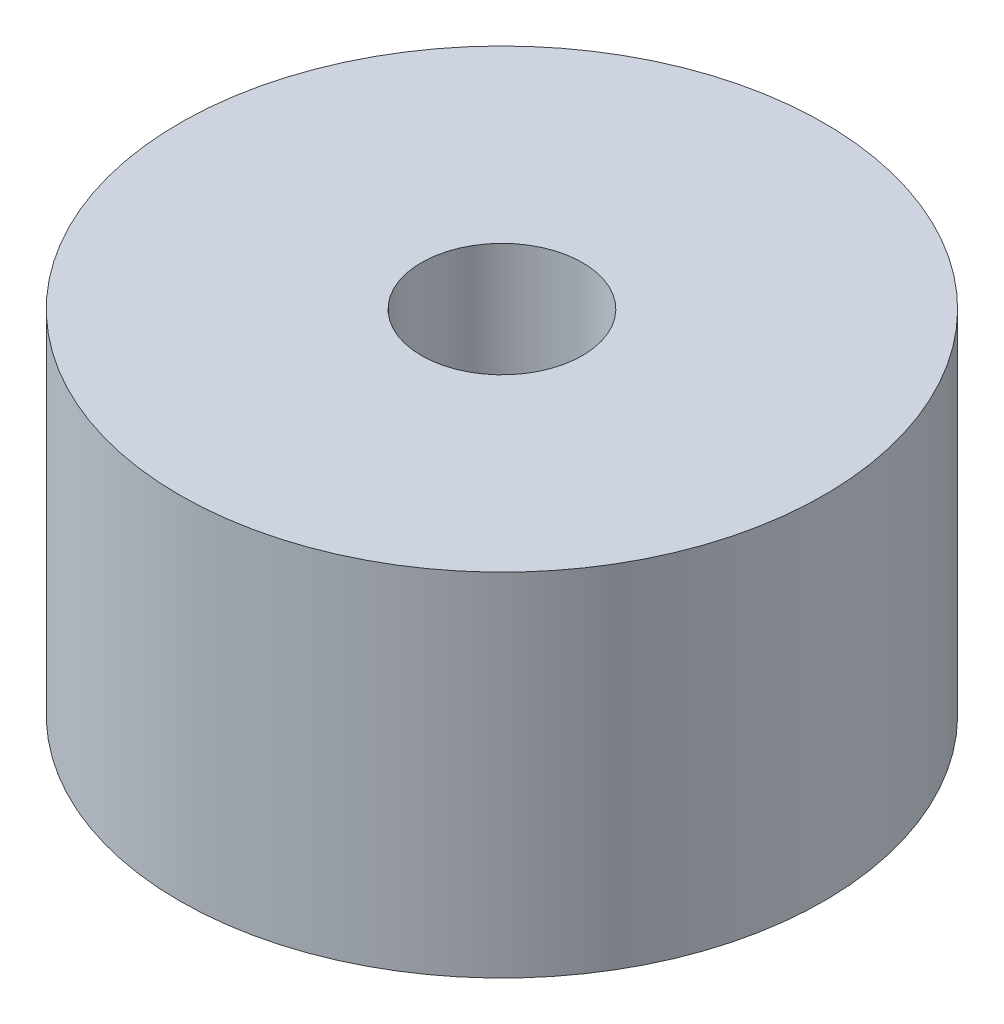
ISO-10303-21;
HEADER;
FILE_DESCRIPTION(('STEP AP214'),'2;1');
FILE_NAME('part.step','',(''),(''),'','','');
FILE_SCHEMA(('AUTOMOTIVE_DESIGN { 1 0 10303 214 1 1 1 1 }'));
ENDSEC;
DATA;
#1=APPLICATION_CONTEXT('core data for automotive mechanical design processes');
#2=APPLICATION_PROTOCOL_DEFINITION('international standard','automotive_design',2000,#1);
#3=PRODUCT_CONTEXT('',#1,'mechanical');
#4=PRODUCT('Part','Part','',(#3));
#5=PRODUCT_RELATED_PRODUCT_CATEGORY('part','',(#4));
#6=PRODUCT_DEFINITION_FORMATION('','',#4);
#7=PRODUCT_DEFINITION_CONTEXT('part definition',#1,'design');
#8=PRODUCT_DEFINITION('design','',#6,#7);
#9=PRODUCT_DEFINITION_SHAPE('','',#8);
#10=(LENGTH_UNIT() NAMED_UNIT(*) SI_UNIT(.MILLI.,.METRE.));
#11=(NAMED_UNIT(*) PLANE_ANGLE_UNIT() SI_UNIT($,.RADIAN.));
#12=(NAMED_UNIT(*) SI_UNIT($,.STERADIAN.) SOLID_ANGLE_UNIT());
#13=UNCERTAINTY_MEASURE_WITH_UNIT(LENGTH_MEASURE(1.E-05),#10,'distance_accuracy_value','');
#14=(GEOMETRIC_REPRESENTATION_CONTEXT(3) GLOBAL_UNCERTAINTY_ASSIGNED_CONTEXT((#13)) GLOBAL_UNIT_ASSIGNED_CONTEXT((#10,
#11,#12)) REPRESENTATION_CONTEXT('',''));
#15=CARTESIAN_POINT('',(0.,0.,0.));
#16=DIRECTION('',(0.,0.,1.));
#17=DIRECTION('',(1.,0.,0.));
#18=AXIS2_PLACEMENT_3D('',#15,#16,#17);
#19=CARTESIAN_POINT('',(0.,6.,0.));
#20=DIRECTION('',(0.,1.,0.));
#21=DIRECTION('',(0.,0.,1.));
#22=AXIS2_PLACEMENT_3D('',#19,#20,#21);
#23=PLANE('',#22);
#24=CARTESIAN_POINT('',(0.,6.,0.));
#25=DIRECTION('',(0.,1.,0.));
#26=DIRECTION('',(0.,0.,1.));
#27=AXIS2_PLACEMENT_3D('',#24,#25,#26);
#28=CIRCLE('',#27,5.5);
#29=CARTESIAN_POINT('',(0.,6.,5.5));
#30=VERTEX_POINT('',#29);
#31=EDGE_CURVE('E10',#30,#30,#28,.T.);
#32=ORIENTED_EDGE('',*,*,#31,.T.);
#33=EDGE_LOOP('',(#32));
#34=FACE_BOUND('',#33,.T.);
#35=CARTESIAN_POINT('',(0.,6.,0.));
#36=DIRECTION('',(0.,1.,0.));
#37=DIRECTION('',(0.,0.,1.));
#38=AXIS2_PLACEMENT_3D('',#35,#36,#37);
#39=CIRCLE('',#38,1.375);
#40=CARTESIAN_POINT('',(0.,6.,1.375));
#41=VERTEX_POINT('',#40);
#42=EDGE_CURVE('E42',#41,#41,#39,.T.);
#43=ORIENTED_EDGE('',*,*,#42,.F.);
#44=EDGE_LOOP('',(#43));
#45=FACE_BOUND('',#44,.T.);
#46=ADVANCED_FACE('F31',(#34,#45),#23,.T.);
#47=CARTESIAN_POINT('',(0.,0.,0.));
#48=DIRECTION('',(0.,1.,0.));
#49=DIRECTION('',(0.,0.,1.));
#50=AXIS2_PLACEMENT_3D('',#47,#48,#49);
#51=PLANE('',#50);
#52=CARTESIAN_POINT('',(0.,0.,0.));
#53=DIRECTION('',(0.,1.,0.));
#54=DIRECTION('',(0.,0.,1.));
#55=AXIS2_PLACEMENT_3D('',#52,#53,#54);
#56=CIRCLE('',#55,5.5);
#57=CARTESIAN_POINT('',(0.,0.,5.5));
#58=VERTEX_POINT('',#57);
#59=EDGE_CURVE('E35',#58,#58,#56,.T.);
#60=ORIENTED_EDGE('',*,*,#59,.F.);
#61=EDGE_LOOP('',(#60));
#62=FACE_BOUND('',#61,.T.);
#63=CARTESIAN_POINT('',(0.,0.,0.));
#64=DIRECTION('',(0.,1.,0.));
#65=DIRECTION('',(0.,0.,1.));
#66=AXIS2_PLACEMENT_3D('',#63,#64,#65);
#67=CIRCLE('',#66,1.375);
#68=CARTESIAN_POINT('',(0.,0.,1.375));
#69=VERTEX_POINT('',#68);
#70=EDGE_CURVE('E44',#69,#69,#67,.T.);
#71=ORIENTED_EDGE('',*,*,#70,.T.);
#72=EDGE_LOOP('',(#71));
#73=FACE_BOUND('',#72,.T.);
#74=ADVANCED_FACE('F54',(#62,#73),#51,.F.);
#75=CARTESIAN_POINT('',(0.,6.,0.));
#76=DIRECTION('',(0.,-1.,0.));
#77=DIRECTION('',(0.,0.,-1.));
#78=AXIS2_PLACEMENT_3D('',#75,#76,#77);
#79=CYLINDRICAL_SURFACE('',#78,5.5);
#80=ORIENTED_EDGE('',*,*,#31,.F.);
#81=EDGE_LOOP('',(#80));
#82=FACE_BOUND('',#81,.T.);
#83=ORIENTED_EDGE('',*,*,#59,.T.);
#84=EDGE_LOOP('',(#83));
#85=FACE_BOUND('',#84,.T.);
#86=ADVANCED_FACE('F33',(#82,#85),#79,.T.);
#87=CARTESIAN_POINT('',(0.,6.,0.));
#88=DIRECTION('',(0.,-1.,0.));
#89=DIRECTION('',(0.,0.,-1.));
#90=AXIS2_PLACEMENT_3D('',#87,#88,#89);
#91=CYLINDRICAL_SURFACE('',#90,1.375);
#92=ORIENTED_EDGE('',*,*,#42,.T.);
#93=EDGE_LOOP('',(#92));
#94=FACE_BOUND('',#93,.T.);
#95=ORIENTED_EDGE('',*,*,#70,.F.);
#96=EDGE_LOOP('',(#95));
#97=FACE_BOUND('',#96,.T.);
#98=ADVANCED_FACE('F50',(#94,#97),#91,.F.);
#99=CLOSED_SHELL('',(#46,#74,#86,#98));
#100=MANIFOLD_SOLID_BREP('B2',#99);
#101=ADVANCED_BREP_SHAPE_REPRESENTATION('',(#18,#100),#14);
#102=SHAPE_DEFINITION_REPRESENTATION(#9,#101);
ENDSEC;
END-ISO-10303-21;
